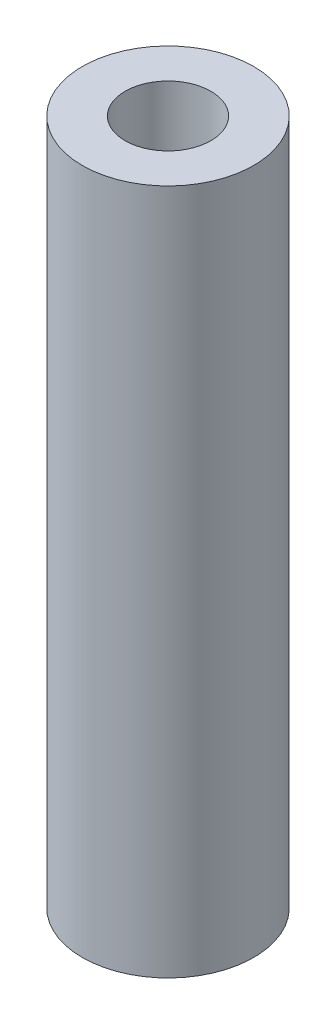
ISO-10303-21;
HEADER;
FILE_DESCRIPTION(('STEP AP214'),'2;1');
FILE_NAME('part.step','',(''),(''),'','','');
FILE_SCHEMA(('AUTOMOTIVE_DESIGN { 1 0 10303 214 1 1 1 1 }'));
ENDSEC;
DATA;
#1=APPLICATION_CONTEXT('core data for automotive mechanical design processes');
#2=APPLICATION_PROTOCOL_DEFINITION('international standard','automotive_design',2000,#1);
#3=PRODUCT_CONTEXT('',#1,'mechanical');
#4=PRODUCT('Part','Part','',(#3));
#5=PRODUCT_RELATED_PRODUCT_CATEGORY('part','',(#4));
#6=PRODUCT_DEFINITION_FORMATION('','',#4);
#7=PRODUCT_DEFINITION_CONTEXT('part definition',#1,'design');
#8=PRODUCT_DEFINITION('design','',#6,#7);
#9=PRODUCT_DEFINITION_SHAPE('','',#8);
#10=(LENGTH_UNIT() NAMED_UNIT(*) SI_UNIT(.MILLI.,.METRE.));
#11=(NAMED_UNIT(*) PLANE_ANGLE_UNIT() SI_UNIT($,.RADIAN.));
#12=(NAMED_UNIT(*) SI_UNIT($,.STERADIAN.) SOLID_ANGLE_UNIT());
#13=UNCERTAINTY_MEASURE_WITH_UNIT(LENGTH_MEASURE(1.E-05),#10,'distance_accuracy_value','');
#14=(GEOMETRIC_REPRESENTATION_CONTEXT(3) GLOBAL_UNCERTAINTY_ASSIGNED_CONTEXT((#13)) GLOBAL_UNIT_ASSIGNED_CONTEXT((#10,
#11,#12)) REPRESENTATION_CONTEXT('',''));
#15=CARTESIAN_POINT('',(0.,0.,0.));
#16=DIRECTION('',(0.,0.,1.));
#17=DIRECTION('',(1.,0.,0.));
#18=AXIS2_PLACEMENT_3D('',#15,#16,#17);
#19=CARTESIAN_POINT('',(0.,24.,0.));
#20=DIRECTION('',(0.,1.,0.));
#21=DIRECTION('',(0.,0.,1.));
#22=AXIS2_PLACEMENT_3D('',#19,#20,#21);
#23=PLANE('',#22);
#24=CARTESIAN_POINT('',(0.,24.,0.));
#25=DIRECTION('',(0.,1.,0.));
#26=DIRECTION('',(0.,0.,1.));
#27=AXIS2_PLACEMENT_3D('',#24,#25,#26);
#28=CIRCLE('',#27,3.);
#29=CARTESIAN_POINT('',(0.,24.,3.));
#30=VERTEX_POINT('',#29);
#31=EDGE_CURVE('E10',#30,#30,#28,.T.);
#32=ORIENTED_EDGE('',*,*,#31,.T.);
#33=EDGE_LOOP('',(#32));
#34=FACE_BOUND('',#33,.T.);
#35=CARTESIAN_POINT('',(0.,24.,0.));
#36=DIRECTION('',(0.,1.,0.));
#37=DIRECTION('',(0.,0.,1.));
#38=AXIS2_PLACEMENT_3D('',#35,#36,#37);
#39=CIRCLE('',#38,1.5);
#40=CARTESIAN_POINT('',(0.,24.,1.5));
#41=VERTEX_POINT('',#40);
#42=EDGE_CURVE('E50',#41,#41,#39,.T.);
#43=ORIENTED_EDGE('',*,*,#42,.F.);
#44=EDGE_LOOP('',(#43));
#45=FACE_BOUND('',#44,.T.);
#46=ADVANCED_FACE('F37',(#34,#45),#23,.T.);
#47=CARTESIAN_POINT('',(0.,0.,0.));
#48=DIRECTION('',(0.,1.,0.));
#49=DIRECTION('',(0.,0.,1.));
#50=AXIS2_PLACEMENT_3D('',#47,#48,#49);
#51=PLANE('',#50);
#52=CARTESIAN_POINT('',(0.,0.,0.));
#53=DIRECTION('',(0.,1.,0.));
#54=DIRECTION('',(0.,0.,1.));
#55=AXIS2_PLACEMENT_3D('',#52,#53,#54);
#56=CIRCLE('',#55,3.);
#57=CARTESIAN_POINT('',(0.,0.,3.));
#58=VERTEX_POINT('',#57);
#59=EDGE_CURVE('E41',#58,#58,#56,.T.);
#60=ORIENTED_EDGE('',*,*,#59,.F.);
#61=EDGE_LOOP('',(#60));
#62=FACE_BOUND('',#61,.T.);
#63=CARTESIAN_POINT('',(0.,0.,0.));
#64=DIRECTION('',(0.,1.,0.));
#65=DIRECTION('',(0.,0.,1.));
#66=AXIS2_PLACEMENT_3D('',#63,#64,#65);
#67=CIRCLE('',#66,1.5);
#68=CARTESIAN_POINT('',(0.,0.,1.5));
#69=VERTEX_POINT('',#68);
#70=EDGE_CURVE('E52',#69,#69,#67,.T.);
#71=ORIENTED_EDGE('',*,*,#70,.T.);
#72=EDGE_LOOP('',(#71));
#73=FACE_BOUND('',#72,.T.);
#74=ADVANCED_FACE('F64',(#62,#73),#51,.F.);
#75=CARTESIAN_POINT('',(0.,24.,0.));
#76=DIRECTION('',(0.,-1.,0.));
#77=DIRECTION('',(0.,0.,-1.));
#78=AXIS2_PLACEMENT_3D('',#75,#76,#77);
#79=CYLINDRICAL_SURFACE('',#78,3.);
#80=ORIENTED_EDGE('',*,*,#31,.F.);
#81=EDGE_LOOP('',(#80));
#82=FACE_BOUND('',#81,.T.);
#83=ORIENTED_EDGE('',*,*,#59,.T.);
#84=EDGE_LOOP('',(#83));
#85=FACE_BOUND('',#84,.T.);
#86=ADVANCED_FACE('F39',(#82,#85),#79,.T.);
#87=CARTESIAN_POINT('',(0.,24.,0.));
#88=DIRECTION('',(0.,-1.,0.));
#89=DIRECTION('',(0.,0.,-1.));
#90=AXIS2_PLACEMENT_3D('',#87,#88,#89);
#91=CYLINDRICAL_SURFACE('',#90,1.5);
#92=ORIENTED_EDGE('',*,*,#42,.T.);
#93=EDGE_LOOP('',(#92));
#94=FACE_BOUND('',#93,.T.);
#95=ORIENTED_EDGE('',*,*,#70,.F.);
#96=EDGE_LOOP('',(#95));
#97=FACE_BOUND('',#96,.T.);
#98=ADVANCED_FACE('F60',(#94,#97),#91,.F.);
#99=CLOSED_SHELL('',(#46,#74,#86,#98));
#100=MANIFOLD_SOLID_BREP('B2',#99);
#101=ADVANCED_BREP_SHAPE_REPRESENTATION('',(#18,#100),#14);
#102=SHAPE_DEFINITION_REPRESENTATION(#9,#101);
ENDSEC;
END-ISO-10303-21;
